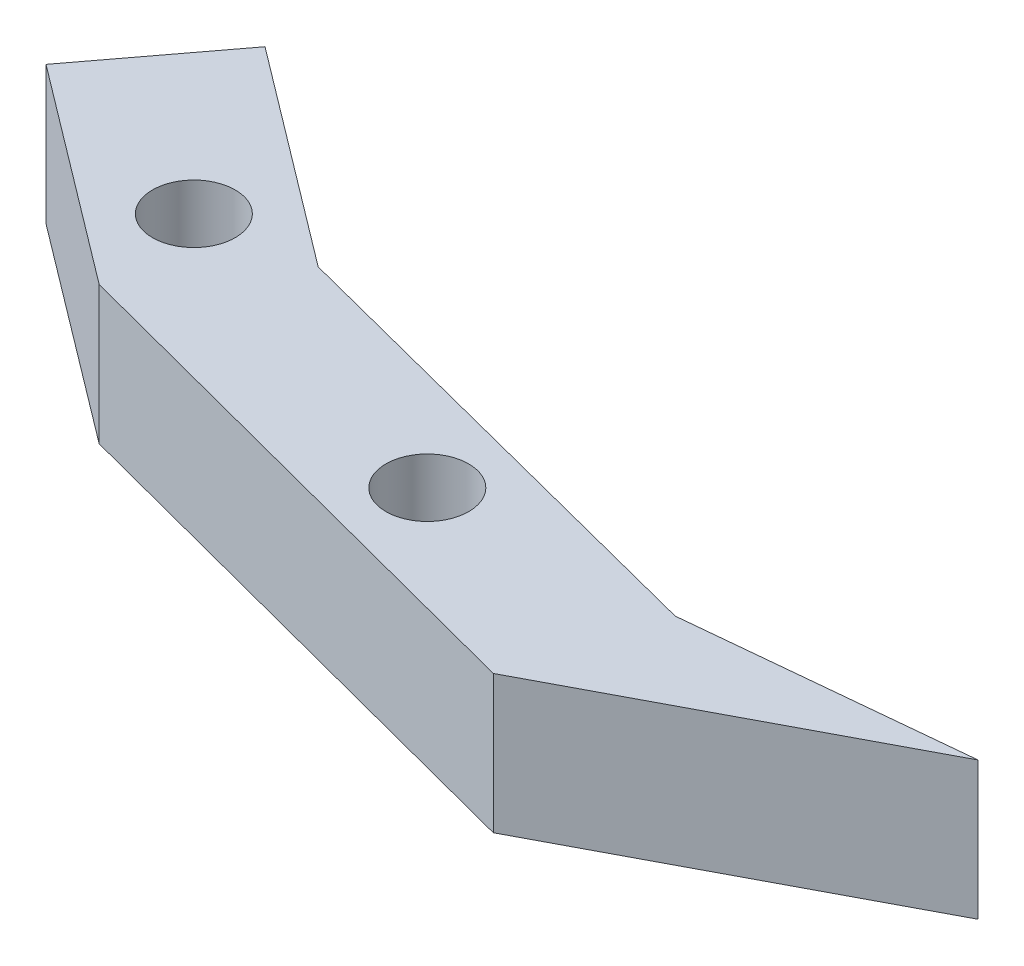
ISO-10303-21;
HEADER;
FILE_DESCRIPTION(('STEP AP214'),'2;1');
FILE_NAME('part.step','',(''),(''),'','','');
FILE_SCHEMA(('AUTOMOTIVE_DESIGN { 1 0 10303 214 1 1 1 1 }'));
ENDSEC;
DATA;
#1=APPLICATION_CONTEXT('core data for automotive mechanical design processes');
#2=APPLICATION_PROTOCOL_DEFINITION('international standard','automotive_design',2000,#1);
#3=PRODUCT_CONTEXT('',#1,'mechanical');
#4=PRODUCT('Part','Part','',(#3));
#5=PRODUCT_RELATED_PRODUCT_CATEGORY('part','',(#4));
#6=PRODUCT_DEFINITION_FORMATION('','',#4);
#7=PRODUCT_DEFINITION_CONTEXT('part definition',#1,'design');
#8=PRODUCT_DEFINITION('design','',#6,#7);
#9=PRODUCT_DEFINITION_SHAPE('','',#8);
#10=(LENGTH_UNIT() NAMED_UNIT(*) SI_UNIT(.MILLI.,.METRE.));
#11=(NAMED_UNIT(*) PLANE_ANGLE_UNIT() SI_UNIT($,.RADIAN.));
#12=(NAMED_UNIT(*) SI_UNIT($,.STERADIAN.) SOLID_ANGLE_UNIT());
#13=UNCERTAINTY_MEASURE_WITH_UNIT(LENGTH_MEASURE(1.E-05),#10,'distance_accuracy_value','');
#14=(GEOMETRIC_REPRESENTATION_CONTEXT(3) GLOBAL_UNCERTAINTY_ASSIGNED_CONTEXT((#13)) GLOBAL_UNIT_ASSIGNED_CONTEXT((#10,
#11,#12)) REPRESENTATION_CONTEXT('',''));
#15=CARTESIAN_POINT('',(0.,0.,0.));
#16=DIRECTION('',(0.,0.,1.));
#17=DIRECTION('',(1.,0.,0.));
#18=AXIS2_PLACEMENT_3D('',#15,#16,#17);
#19=CARTESIAN_POINT('',(0.,5.,0.));
#20=DIRECTION('',(0.,-1.,0.));
#21=DIRECTION('',(0.,0.,-1.));
#22=AXIS2_PLACEMENT_3D('',#19,#20,#21);
#23=PLANE('',#22);
#24=DIRECTION('',(0.967396729552416,0.,0.25326580434652));
#25=VECTOR('',#24,1.);
#26=CARTESIAN_POINT('',(-26.5840746825531,5.,9.43894353797432));
#27=LINE('',#26,#25);
#28=CARTESIAN_POINT('',(-26.5840746825531,5.,9.43894353797432));
#29=VERTEX_POINT('',#28);
#30=CARTESIAN_POINT('',(-7.23614009150474,5.,14.5042596249047));
#31=VERTEX_POINT('',#30);
#32=EDGE_CURVE('E142',#29,#31,#27,.T.);
#33=ORIENTED_EDGE('',*,*,#32,.T.);
#34=DIRECTION('',(0.884411680657287,0.,-0.466707594878157));
#35=VECTOR('',#34,1.);
#36=CARTESIAN_POINT('',(-7.23614009150474,5.,14.5042596249047));
#37=LINE('',#36,#35);
#38=CARTESIAN_POINT('',(4.26121175703999,5.,8.43706089148867));
#39=VERTEX_POINT('',#38);
#40=EDGE_CURVE('E96',#31,#39,#37,.T.);
#41=ORIENTED_EDGE('',*,*,#40,.T.);
#42=DIRECTION('',(-0.995312099293691,0.,0.0967151746086695));
#43=VECTOR('',#42,1.);
#44=CARTESIAN_POINT('',(-5.73878824296001,5.,9.40876790356359));
#45=LINE('',#44,#43);
#46=CARTESIAN_POINT('',(-5.73878824296001,5.,9.40876790356359));
#47=VERTEX_POINT('',#46);
#48=EDGE_CURVE('E152',#39,#47,#45,.T.);
#49=ORIENTED_EDGE('',*,*,#48,.T.);
#50=DIRECTION('',(-0.968365972966637,0.,-0.249534250956414));
#51=VECTOR('',#50,1.);
#52=CARTESIAN_POINT('',(-23.1693757563595,5.,4.91715138634814));
#53=LINE('',#52,#51);
#54=CARTESIAN_POINT('',(-23.1693757563595,5.,4.91715138634814));
#55=VERTEX_POINT('',#54);
#56=EDGE_CURVE('E115',#47,#55,#53,.T.);
#57=ORIENTED_EDGE('',*,*,#56,.T.);
#58=DIRECTION('',(-0.798017227280239,0.,-0.602634636379256));
#59=VECTOR('',#58,1.);
#60=CARTESIAN_POINT('',(-31.0414860273767,5.,-1.02759034169717));
#61=LINE('',#60,#59);
#62=CARTESIAN_POINT('',(-31.0414860273767,5.,-1.02759034169717));
#63=VERTEX_POINT('',#62);
#64=EDGE_CURVE('E108',#55,#63,#61,.T.);
#65=ORIENTED_EDGE('',*,*,#64,.T.);
#66=DIRECTION('',(-0.602634636379256,0.,0.79801722728024));
#67=VECTOR('',#66,1.);
#68=CARTESIAN_POINT('',(-31.0414860273767,5.,-1.02759034169717));
#69=LINE('',#68,#67);
#70=CARTESIAN_POINT('',(-34.4561849535703,5.,3.49420180992901));
#71=VERTEX_POINT('',#70);
#72=EDGE_CURVE('E107',#63,#71,#69,.T.);
#73=ORIENTED_EDGE('',*,*,#72,.T.);
#74=DIRECTION('',(0.79801722728024,0.,0.602634636379256));
#75=VECTOR('',#74,1.);
#76=CARTESIAN_POINT('',(-34.4561849535703,5.,3.49420180992901));
#77=LINE('',#76,#75);
#78=EDGE_CURVE('E57',#71,#29,#77,.T.);
#79=ORIENTED_EDGE('',*,*,#78,.T.);
#80=EDGE_LOOP('',(#33,#41,#49,#57,#65,#73,#79));
#81=FACE_BOUND('',#80,.T.);
#82=CARTESIAN_POINT('',(-27.0875531141237,5.,5.50457055063356));
#83=DIRECTION('',(0.,1.,0.));
#84=DIRECTION('',(0.,0.,1.));
#85=AXIS2_PLACEMENT_3D('',#82,#83,#84);
#86=CIRCLE('',#85,1.5);
#87=CARTESIAN_POINT('',(-27.0875531141237,5.,7.00457055063356));
#88=VERTEX_POINT('',#87);
#89=EDGE_CURVE('E132',#88,#88,#86,.T.);
#90=ORIENTED_EDGE('',*,*,#89,.F.);
#91=EDGE_LOOP('',(#90));
#92=FACE_BOUND('',#91,.T.);
#93=CARTESIAN_POINT('',(-14.2599456496118,5.,9.87219173032113));
#94=DIRECTION('',(0.,1.,0.));
#95=DIRECTION('',(0.,0.,1.));
#96=AXIS2_PLACEMENT_3D('',#93,#94,#95);
#97=CIRCLE('',#96,1.5);
#98=CARTESIAN_POINT('',(-14.2599456496118,5.,11.3721917303211));
#99=VERTEX_POINT('',#98);
#100=EDGE_CURVE('E169',#99,#99,#97,.T.);
#101=ORIENTED_EDGE('',*,*,#100,.F.);
#102=EDGE_LOOP('',(#101));
#103=FACE_BOUND('',#102,.T.);
#104=ADVANCED_FACE('F39',(#81,#92,#103),#23,.F.);
#105=CARTESIAN_POINT('',(0.,0.,0.));
#106=DIRECTION('',(0.,-1.,0.));
#107=DIRECTION('',(0.,0.,-1.));
#108=AXIS2_PLACEMENT_3D('',#105,#106,#107);
#109=PLANE('',#108);
#110=CARTESIAN_POINT('',(-27.0875531141237,0.,5.50457055063356));
#111=DIRECTION('',(0.,1.,0.));
#112=DIRECTION('',(0.,0.,1.));
#113=AXIS2_PLACEMENT_3D('',#110,#111,#112);
#114=CIRCLE('',#113,1.5);
#115=CARTESIAN_POINT('',(-27.0875531141237,0.,7.00457055063356));
#116=VERTEX_POINT('',#115);
#117=EDGE_CURVE('E167',#116,#116,#114,.T.);
#118=ORIENTED_EDGE('',*,*,#117,.T.);
#119=EDGE_LOOP('',(#118));
#120=FACE_BOUND('',#119,.T.);
#121=DIRECTION('',(0.967396729552416,0.,0.25326580434652));
#122=VECTOR('',#121,1.);
#123=CARTESIAN_POINT('',(-26.5840746825531,0.,9.43894353797432));
#124=LINE('',#123,#122);
#125=CARTESIAN_POINT('',(-26.5840746825531,0.,9.43894353797432));
#126=VERTEX_POINT('',#125);
#127=CARTESIAN_POINT('',(-7.23614009150474,0.,14.5042596249047));
#128=VERTEX_POINT('',#127);
#129=EDGE_CURVE('E127',#126,#128,#124,.T.);
#130=ORIENTED_EDGE('',*,*,#129,.F.);
#131=DIRECTION('',(0.79801722728024,0.,0.602634636379256));
#132=VECTOR('',#131,1.);
#133=CARTESIAN_POINT('',(-34.4561849535703,0.,3.49420180992901));
#134=LINE('',#133,#132);
#135=CARTESIAN_POINT('',(-34.4561849535703,0.,3.49420180992901));
#136=VERTEX_POINT('',#135);
#137=EDGE_CURVE('E88',#136,#126,#134,.T.);
#138=ORIENTED_EDGE('',*,*,#137,.F.);
#139=DIRECTION('',(-0.602634636379256,0.,0.79801722728024));
#140=VECTOR('',#139,1.);
#141=CARTESIAN_POINT('',(-31.0414860273767,0.,-1.02759034169717));
#142=LINE('',#141,#140);
#143=CARTESIAN_POINT('',(-31.0414860273767,0.,-1.02759034169717));
#144=VERTEX_POINT('',#143);
#145=EDGE_CURVE('E85',#144,#136,#142,.T.);
#146=ORIENTED_EDGE('',*,*,#145,.F.);
#147=DIRECTION('',(-0.798017227280239,0.,-0.602634636379256));
#148=VECTOR('',#147,1.);
#149=CARTESIAN_POINT('',(-31.0414860273767,0.,-1.02759034169717));
#150=LINE('',#149,#148);
#151=CARTESIAN_POINT('',(-23.1693757563595,0.,4.91715138634814));
#152=VERTEX_POINT('',#151);
#153=EDGE_CURVE('E117',#152,#144,#150,.T.);
#154=ORIENTED_EDGE('',*,*,#153,.F.);
#155=DIRECTION('',(-0.968365972966637,0.,-0.249534250956414));
#156=VECTOR('',#155,1.);
#157=CARTESIAN_POINT('',(-23.1693757563595,0.,4.91715138634814));
#158=LINE('',#157,#156);
#159=CARTESIAN_POINT('',(-5.73878824296001,0.,9.40876790356359));
#160=VERTEX_POINT('',#159);
#161=EDGE_CURVE('E138',#160,#152,#158,.T.);
#162=ORIENTED_EDGE('',*,*,#161,.F.);
#163=DIRECTION('',(-0.995312099293691,0.,0.0967151746086695));
#164=VECTOR('',#163,1.);
#165=CARTESIAN_POINT('',(-5.73878824296001,0.,9.40876790356359));
#166=LINE('',#165,#164);
#167=CARTESIAN_POINT('',(4.26121175703999,0.,8.43706089148867));
#168=VERTEX_POINT('',#167);
#169=EDGE_CURVE('E136',#168,#160,#166,.T.);
#170=ORIENTED_EDGE('',*,*,#169,.F.);
#171=DIRECTION('',(0.884411680657287,0.,-0.466707594878157));
#172=VECTOR('',#171,1.);
#173=CARTESIAN_POINT('',(-7.23614009150474,0.,14.5042596249047));
#174=LINE('',#173,#172);
#175=EDGE_CURVE('E133',#128,#168,#174,.T.);
#176=ORIENTED_EDGE('',*,*,#175,.F.);
#177=EDGE_LOOP('',(#130,#138,#146,#154,#162,#170,#176));
#178=FACE_BOUND('',#177,.T.);
#179=CARTESIAN_POINT('',(-14.2599456496118,0.,9.87219173032113));
#180=DIRECTION('',(0.,1.,0.));
#181=DIRECTION('',(0.,0.,1.));
#182=AXIS2_PLACEMENT_3D('',#179,#180,#181);
#183=CIRCLE('',#182,1.5);
#184=CARTESIAN_POINT('',(-14.2599456496118,0.,11.3721917303211));
#185=VERTEX_POINT('',#184);
#186=EDGE_CURVE('E171',#185,#185,#183,.T.);
#187=ORIENTED_EDGE('',*,*,#186,.T.);
#188=EDGE_LOOP('',(#187));
#189=FACE_BOUND('',#188,.T.);
#190=ADVANCED_FACE('F159',(#120,#178,#189),#109,.T.);
#191=CARTESIAN_POINT('',(-26.5840746825531,5.,9.43894353797432));
#192=DIRECTION('',(0.25326580434652,0.,-0.967396729552416));
#193=DIRECTION('',(-0.967396729552416,0.,-0.25326580434652));
#194=AXIS2_PLACEMENT_3D('',#191,#192,#193);
#195=PLANE('',#194);
#196=ORIENTED_EDGE('',*,*,#129,.T.);
#197=DIRECTION('',(0.,-1.,0.));
#198=VECTOR('',#197,1.);
#199=CARTESIAN_POINT('',(-7.23614009150474,5.,14.5042596249047));
#200=LINE('',#199,#198);
#201=EDGE_CURVE('E11',#31,#128,#200,.T.);
#202=ORIENTED_EDGE('',*,*,#201,.F.);
#203=ORIENTED_EDGE('',*,*,#32,.F.);
#204=DIRECTION('',(0.,-1.,0.));
#205=VECTOR('',#204,1.);
#206=CARTESIAN_POINT('',(-26.5840746825531,5.,9.43894353797432));
#207=LINE('',#206,#205);
#208=EDGE_CURVE('E128',#29,#126,#207,.T.);
#209=ORIENTED_EDGE('',*,*,#208,.T.);
#210=EDGE_LOOP('',(#196,#202,#203,#209));
#211=FACE_BOUND('',#210,.T.);
#212=ADVANCED_FACE('F41',(#211),#195,.F.);
#213=CARTESIAN_POINT('',(-7.23614009150474,5.,14.5042596249047));
#214=DIRECTION('',(-0.466707594878157,0.,-0.884411680657287));
#215=DIRECTION('',(-0.884411680657287,0.,0.466707594878157));
#216=AXIS2_PLACEMENT_3D('',#213,#214,#215);
#217=PLANE('',#216);
#218=ORIENTED_EDGE('',*,*,#175,.T.);
#219=DIRECTION('',(0.,-1.,0.));
#220=VECTOR('',#219,1.);
#221=CARTESIAN_POINT('',(4.26121175703999,5.,8.43706089148867));
#222=LINE('',#221,#220);
#223=EDGE_CURVE('E48',#39,#168,#222,.T.);
#224=ORIENTED_EDGE('',*,*,#223,.F.);
#225=ORIENTED_EDGE('',*,*,#40,.F.);
#226=ORIENTED_EDGE('',*,*,#201,.T.);
#227=EDGE_LOOP('',(#218,#224,#225,#226));
#228=FACE_BOUND('',#227,.T.);
#229=ADVANCED_FACE('F201',(#228),#217,.F.);
#230=CARTESIAN_POINT('',(-5.73878824296001,5.,9.40876790356359));
#231=DIRECTION('',(0.0967151746086695,0.,0.995312099293691));
#232=DIRECTION('',(0.995312099293691,0.,-0.0967151746086695));
#233=AXIS2_PLACEMENT_3D('',#230,#231,#232);
#234=PLANE('',#233);
#235=ORIENTED_EDGE('',*,*,#169,.T.);
#236=DIRECTION('',(0.,-1.,0.));
#237=VECTOR('',#236,1.);
#238=CARTESIAN_POINT('',(-5.73878824296001,5.,9.40876790356359));
#239=LINE('',#238,#237);
#240=EDGE_CURVE('E150',#47,#160,#239,.T.);
#241=ORIENTED_EDGE('',*,*,#240,.F.);
#242=ORIENTED_EDGE('',*,*,#48,.F.);
#243=ORIENTED_EDGE('',*,*,#223,.T.);
#244=EDGE_LOOP('',(#235,#241,#242,#243));
#245=FACE_BOUND('',#244,.T.);
#246=ADVANCED_FACE('F151',(#245),#234,.F.);
#247=CARTESIAN_POINT('',(-23.1693757563595,5.,4.91715138634814));
#248=DIRECTION('',(-0.249534250956414,0.,0.968365972966637));
#249=DIRECTION('',(0.968365972966637,0.,0.249534250956414));
#250=AXIS2_PLACEMENT_3D('',#247,#248,#249);
#251=PLANE('',#250);
#252=ORIENTED_EDGE('',*,*,#161,.T.);
#253=DIRECTION('',(0.,-1.,0.));
#254=VECTOR('',#253,1.);
#255=CARTESIAN_POINT('',(-23.1693757563595,5.,4.91715138634814));
#256=LINE('',#255,#254);
#257=EDGE_CURVE('E123',#55,#152,#256,.T.);
#258=ORIENTED_EDGE('',*,*,#257,.F.);
#259=ORIENTED_EDGE('',*,*,#56,.F.);
#260=ORIENTED_EDGE('',*,*,#240,.T.);
#261=EDGE_LOOP('',(#252,#258,#259,#260));
#262=FACE_BOUND('',#261,.T.);
#263=ADVANCED_FACE('F165',(#262),#251,.F.);
#264=CARTESIAN_POINT('',(-31.0414860273767,5.,-1.02759034169717));
#265=DIRECTION('',(-0.602634636379256,0.,0.79801722728024));
#266=DIRECTION('',(0.79801722728024,0.,0.602634636379256));
#267=AXIS2_PLACEMENT_3D('',#264,#265,#266);
#268=PLANE('',#267);
#269=ORIENTED_EDGE('',*,*,#153,.T.);
#270=DIRECTION('',(0.,-1.,0.));
#271=VECTOR('',#270,1.);
#272=CARTESIAN_POINT('',(-31.0414860273767,5.,-1.02759034169717));
#273=LINE('',#272,#271);
#274=EDGE_CURVE('E120',#63,#144,#273,.T.);
#275=ORIENTED_EDGE('',*,*,#274,.F.);
#276=ORIENTED_EDGE('',*,*,#64,.F.);
#277=ORIENTED_EDGE('',*,*,#257,.T.);
#278=EDGE_LOOP('',(#269,#275,#276,#277));
#279=FACE_BOUND('',#278,.T.);
#280=ADVANCED_FACE('F116',(#279),#268,.F.);
#281=CARTESIAN_POINT('',(-31.0414860273767,5.,-1.02759034169717));
#282=DIRECTION('',(0.79801722728024,0.,0.602634636379256));
#283=DIRECTION('',(0.602634636379256,0.,-0.79801722728024));
#284=AXIS2_PLACEMENT_3D('',#281,#282,#283);
#285=PLANE('',#284);
#286=ORIENTED_EDGE('',*,*,#145,.T.);
#287=DIRECTION('',(0.,-1.,0.));
#288=VECTOR('',#287,1.);
#289=CARTESIAN_POINT('',(-34.4561849535703,5.,3.49420180992901));
#290=LINE('',#289,#288);
#291=EDGE_CURVE('E122',#71,#136,#290,.T.);
#292=ORIENTED_EDGE('',*,*,#291,.F.);
#293=ORIENTED_EDGE('',*,*,#72,.F.);
#294=ORIENTED_EDGE('',*,*,#274,.T.);
#295=EDGE_LOOP('',(#286,#292,#293,#294));
#296=FACE_BOUND('',#295,.T.);
#297=ADVANCED_FACE('F125',(#296),#285,.F.);
#298=CARTESIAN_POINT('',(-34.4561849535703,5.,3.49420180992901));
#299=DIRECTION('',(0.602634636379256,0.,-0.79801722728024));
#300=DIRECTION('',(-0.79801722728024,0.,-0.602634636379256));
#301=AXIS2_PLACEMENT_3D('',#298,#299,#300);
#302=PLANE('',#301);
#303=ORIENTED_EDGE('',*,*,#137,.T.);
#304=ORIENTED_EDGE('',*,*,#208,.F.);
#305=ORIENTED_EDGE('',*,*,#78,.F.);
#306=ORIENTED_EDGE('',*,*,#291,.T.);
#307=EDGE_LOOP('',(#303,#304,#305,#306));
#308=FACE_BOUND('',#307,.T.);
#309=ADVANCED_FACE('F194',(#308),#302,.F.);
#310=CARTESIAN_POINT('',(-27.0875531141237,5.,5.50457055063356));
#311=DIRECTION('',(0.,-1.,0.));
#312=DIRECTION('',(0.,0.,-1.));
#313=AXIS2_PLACEMENT_3D('',#310,#311,#312);
#314=CYLINDRICAL_SURFACE('',#313,1.5);
#315=ORIENTED_EDGE('',*,*,#89,.T.);
#316=EDGE_LOOP('',(#315));
#317=FACE_BOUND('',#316,.T.);
#318=ORIENTED_EDGE('',*,*,#117,.F.);
#319=EDGE_LOOP('',(#318));
#320=FACE_BOUND('',#319,.T.);
#321=ADVANCED_FACE('F189',(#317,#320),#314,.F.);
#322=CARTESIAN_POINT('',(-14.2599456496118,5.,9.87219173032113));
#323=DIRECTION('',(0.,-1.,0.));
#324=DIRECTION('',(0.,0.,-1.));
#325=AXIS2_PLACEMENT_3D('',#322,#323,#324);
#326=CYLINDRICAL_SURFACE('',#325,1.5);
#327=ORIENTED_EDGE('',*,*,#100,.T.);
#328=EDGE_LOOP('',(#327));
#329=FACE_BOUND('',#328,.T.);
#330=ORIENTED_EDGE('',*,*,#186,.F.);
#331=EDGE_LOOP('',(#330));
#332=FACE_BOUND('',#331,.T.);
#333=ADVANCED_FACE('F177',(#329,#332),#326,.F.);
#334=CLOSED_SHELL('',(#104,#190,#212,#229,#246,#263,#280,#297,#309,#321,#333));
#335=MANIFOLD_SOLID_BREP('B2',#334);
#336=ADVANCED_BREP_SHAPE_REPRESENTATION('',(#18,#335),#14);
#337=SHAPE_DEFINITION_REPRESENTATION(#9,#336);
ENDSEC;
END-ISO-10303-21;
